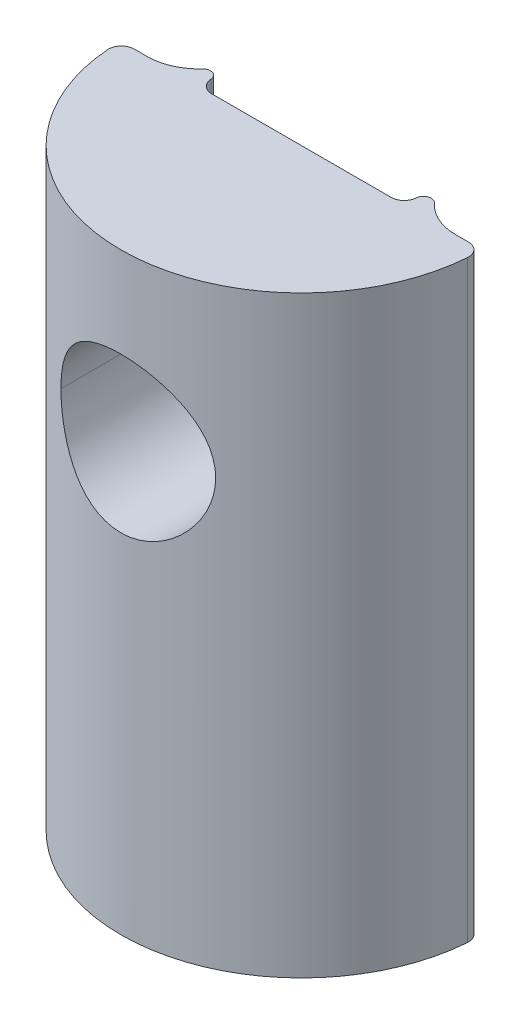
ISO-10303-21;
HEADER;
FILE_DESCRIPTION(('STEP AP214'),'2;1');
FILE_NAME('part.step','',(''),(''),'','','');
FILE_SCHEMA(('AUTOMOTIVE_DESIGN { 1 0 10303 214 1 1 1 1 }'));
ENDSEC;
DATA;
#1=APPLICATION_CONTEXT('core data for automotive mechanical design processes');
#2=APPLICATION_PROTOCOL_DEFINITION('international standard','automotive_design',2000,#1);
#3=PRODUCT_CONTEXT('',#1,'mechanical');
#4=PRODUCT('Part','Part','',(#3));
#5=PRODUCT_RELATED_PRODUCT_CATEGORY('part','',(#4));
#6=PRODUCT_DEFINITION_FORMATION('','',#4);
#7=PRODUCT_DEFINITION_CONTEXT('part definition',#1,'design');
#8=PRODUCT_DEFINITION('design','',#6,#7);
#9=PRODUCT_DEFINITION_SHAPE('','',#8);
#10=(LENGTH_UNIT() NAMED_UNIT(*) SI_UNIT(.MILLI.,.METRE.));
#11=(NAMED_UNIT(*) PLANE_ANGLE_UNIT() SI_UNIT($,.RADIAN.));
#12=(NAMED_UNIT(*) SI_UNIT($,.STERADIAN.) SOLID_ANGLE_UNIT());
#13=UNCERTAINTY_MEASURE_WITH_UNIT(LENGTH_MEASURE(1.E-05),#10,'distance_accuracy_value','');
#14=(GEOMETRIC_REPRESENTATION_CONTEXT(3) GLOBAL_UNCERTAINTY_ASSIGNED_CONTEXT((#13)) GLOBAL_UNIT_ASSIGNED_CONTEXT((#10,
#11,#12)) REPRESENTATION_CONTEXT('',''));
#15=CARTESIAN_POINT('',(0.,0.,0.));
#16=DIRECTION('',(0.,0.,1.));
#17=DIRECTION('',(1.,0.,0.));
#18=AXIS2_PLACEMENT_3D('',#15,#16,#17);
#19=CARTESIAN_POINT('',(0.,0.,3.5));
#20=DIRECTION('',(0.,0.,1.));
#21=DIRECTION('',(1.,0.,0.));
#22=AXIS2_PLACEMENT_3D('',#19,#20,#21);
#23=CYLINDRICAL_SURFACE('',#22,3.);
#24=DIRECTION('',(0.,0.,-1.));
#25=VECTOR('',#24,1.);
#26=CARTESIAN_POINT('',(3.,0.,3.5));
#27=LINE('',#26,#25);
#28=CARTESIAN_POINT('',(3.,0.,6.32455531171955));
#29=VERTEX_POINT('',#28);
#30=CARTESIAN_POINT('',(3.,0.,0.));
#31=VERTEX_POINT('',#30);
#32=EDGE_CURVE('E11',#29,#31,#27,.T.);
#33=ORIENTED_EDGE('',*,*,#32,.F.);
#34=CARTESIAN_POINT('',(0.,3.,6.9999999965));
#35=CARTESIAN_POINT('',(0.0489138956607457,3.00000410256812,7.00000183068981));
#36=CARTESIAN_POINT('',(0.0978278435569607,2.99881244268316,6.99948736787946));
#37=CARTESIAN_POINT('',(0.195458042792353,2.99404407710322,6.99744026648014));
#38=CARTESIAN_POINT('',(0.244174462670805,2.99047028760668,6.99590887282453));
#39=CARTESIAN_POINT('',(0.341388674207266,2.98093857612104,6.99183989532414));
#40=CARTESIAN_POINT('',(0.389886144636314,2.9749778785505,6.98930114011501));
#41=CARTESIAN_POINT('',(0.486642422012838,2.96067927481051,6.98323254092362));
#42=CARTESIAN_POINT('',(0.534899774330794,2.95233301995866,6.97969921694233));
#43=CARTESIAN_POINT('',(0.631955166421678,2.93311097183594,6.97158927104654));
#44=CARTESIAN_POINT('',(0.68074096910353,2.9221825258811,6.96699097871581));
#45=CARTESIAN_POINT('',(0.777631706234057,2.8979208908798,6.95684286423039));
#46=CARTESIAN_POINT('',(0.825736355299641,2.88458672428681,6.95129265531698));
#47=CARTESIAN_POINT('',(0.921249784753241,2.85551937419085,6.93928109739052));
#48=CARTESIAN_POINT('',(0.968656215972326,2.83977952123751,6.93281721921476));
#49=CARTESIAN_POINT('',(1.06276014613393,2.805906398884,6.91901830355708));
#50=CARTESIAN_POINT('',(1.10945266868913,2.78776109435895,6.91167890543437));
#51=CARTESIAN_POINT('',(1.20151674983731,2.74933384223792,6.89626881054077));
#52=CARTESIAN_POINT('',(1.24689417207534,2.72906422633106,6.88820236879365));
#53=CARTESIAN_POINT('',(1.33649365005603,2.68634183903295,6.87138000355238));
#54=CARTESIAN_POINT('',(1.38071539317606,2.66388848451788,6.86262389601609));
#55=CARTESIAN_POINT('',(1.46800061228671,2.61680356338657,6.84448436296802));
#56=CARTESIAN_POINT('',(1.51106086000438,2.59216660751874,6.83509940014924));
#57=CARTESIAN_POINT('',(1.59602303199206,2.54071933284691,6.81576245592253));
#58=CARTESIAN_POINT('',(1.63791842877036,2.51389917983221,6.80580797651569));
#59=CARTESIAN_POINT('',(1.71897218605899,2.45915698232891,6.78578085130398));
#60=CARTESIAN_POINT('',(1.75817518389837,2.43129602249619,6.77572174175876));
#61=CARTESIAN_POINT('',(1.83507382531065,2.3738123771556,6.75530043774594));
#62=CARTESIAN_POINT('',(1.87277199768456,2.34419287491043,6.74493880719775));
#63=CARTESIAN_POINT('',(1.94667121523819,2.28319625142322,6.72398294603298));
#64=CARTESIAN_POINT('',(1.98287179863101,2.25181859496752,6.71338864519074));
#65=CARTESIAN_POINT('',(2.05378816796158,2.18730950987627,6.69203473363754));
#66=CARTESIAN_POINT('',(2.08850023045642,2.15417409994325,6.68127479057027));
#67=CARTESIAN_POINT('',(2.15643473900844,2.0861710539031,6.65965946287236));
#68=CARTESIAN_POINT('',(2.18965093152526,2.05129723651427,6.64880387025238));
#69=CARTESIAN_POINT('',(2.25421462081131,1.98015080362108,6.62719170835579));
#70=CARTESIAN_POINT('',(2.28557031556905,1.94388569862687,6.61643491385857));
#71=CARTESIAN_POINT('',(2.34643460584564,1.86996037829845,6.5950952788966));
#72=CARTESIAN_POINT('',(2.37594796214921,1.83230419622083,6.58451204702107));
#73=CARTESIAN_POINT('',(2.4331501562864,1.7556006808286,6.56358952312516));
#74=CARTESIAN_POINT('',(2.46084002088053,1.71655414980125,6.55325009596707));
#75=CARTESIAN_POINT('',(2.51544514176985,1.63554813054925,6.53248973251664));
#76=CARTESIAN_POINT('',(2.54228531146726,1.59353458444912,6.52208202870025));
#77=CARTESIAN_POINT('',(2.59368570589883,1.50845697015938,6.50181145006659));
#78=CARTESIAN_POINT('',(2.61826159037612,1.46540320683219,6.49194505999556));
#79=CARTESIAN_POINT('',(2.66516388130064,1.37824915737547,6.47283086919287));
#80=CARTESIAN_POINT('',(2.68750119978789,1.33415538709659,6.46358014983501));
#81=CARTESIAN_POINT('',(2.72995675775495,1.24492577638461,6.44576332177738));
#82=CARTESIAN_POINT('',(2.75008074193835,1.19979301985005,6.43719545746664));
#83=CARTESIAN_POINT('',(2.78837481310104,1.10791371453158,6.42070132648431));
#84=CARTESIAN_POINT('',(2.80651755798841,1.06115409040791,6.41278433980888));
#85=CARTESIAN_POINT('',(2.84033763627126,0.96702433691713,6.39787629926695));
#86=CARTESIAN_POINT('',(2.85603300534015,0.919661758738418,6.39087853815674));
#87=CARTESIAN_POINT('',(2.88498694345635,0.824330166431908,6.37786022208387));
#88=CARTESIAN_POINT('',(2.89825740301884,0.776365415504366,6.37183491668052));
#89=CARTESIAN_POINT('',(2.92238885055373,0.679833090328599,6.36080333162924));
#90=CARTESIAN_POINT('',(2.93325516125109,0.631267104322355,6.35579480293342));
#91=CARTESIAN_POINT('',(2.95241539952209,0.534444262616765,6.34691678379841));
#92=CARTESIAN_POINT('',(2.96075218270494,0.486197626445365,6.34302838117267));
#93=CARTESIAN_POINT('',(2.97502443926764,0.389494585319185,6.33634681890388));
#94=CARTESIAN_POINT('',(2.98097042517302,0.341040066984096,6.33354886617335));
#95=CARTESIAN_POINT('',(2.99047711422751,0.243923933925383,6.32906594452896));
#96=CARTESIAN_POINT('',(2.99404157584831,0.195262768071483,6.32737922195395));
#97=CARTESIAN_POINT('',(2.99880249376857,0.0977345356951967,6.32512327778318));
#98=CARTESIAN_POINT('',(2.99999582224139,0.0488672823064986,6.32455553226866));
#99=CARTESIAN_POINT('',(3.00000000000001,0.,6.32455531171954));
#100=B_SPLINE_CURVE_WITH_KNOTS('',3,(#34,#35,#36,#37,#38,#39,#40,#41,#42,#43,#44,#45,#46,#47,
#48,#49,#50,#51,#52,#53,#54,#55,#56,#57,#58,#59,#60,#61,#62,#63,#64,#65,#66,#67,#68,#69,#70,#71,
#72,#73,#74,#75,#76,#77,#78,#79,#80,#81,#82,#83,#84,#85,#86,#87,#88,#89,#90,#91,#92,#93,#94,#95,
#96,#97,#98,#99),.UNSPECIFIED.,.F.,.F.,(4,2,2,2,2,2,2,2,2,2,2,2,2,2,2,2,2,2,2,2,2,2,2,2,2,2,2,2,
2,2,2,2,4),(0.,0.146724353003398,0.293269415423172,0.439985382799481,0.587221231205359,
0.737767381875317,0.888374844188878,1.0394076846051,1.19122690951126,1.34220909769009,
1.49323171392776,1.64463803391459,1.79676873642973,1.94412026021005,2.09121273661372,
2.23835023648207,2.38583655330257,2.53389102800831,2.6812354573499,2.82818186353915,
2.97504480780068,3.12777236482923,3.27934877431178,3.43014615635024,3.58054241711097,
3.7328047871791,3.88388583881275,4.03420492936246,4.18418781081787,4.33146595260845,
4.47808922650448,4.62448055257133,4.77106485957994),.UNSPECIFIED.);
#101=CARTESIAN_POINT('',(0.,3.,7.));
#102=VERTEX_POINT('',#101);
#103=EDGE_CURVE('E45',#102,#29,#100,.T.);
#104=ORIENTED_EDGE('',*,*,#103,.F.);
#105=CARTESIAN_POINT('',(-3.00000000000001,0.,6.32455532120638));
#106=CARTESIAN_POINT('',(-2.99999578067987,0.0488610884941441,6.32455556201012));
#107=CARTESIAN_POINT('',(-2.99880237394905,0.0977221237949391,6.3251233440901));
#108=CARTESIAN_POINT('',(-2.99404150046391,0.195242075926184,6.32737926709102));
#109=CARTESIAN_POINT('',(-2.99047696011818,0.243901167595723,6.32906602698356));
#110=CARTESIAN_POINT('',(-2.98097018764038,0.341017267780898,6.33354898726171));
#111=CARTESIAN_POINT('',(-2.97502399758109,0.389473803555633,6.33634703436644));
#112=CARTESIAN_POINT('',(-2.96075204472432,0.486185162747082,6.34302845581051));
#113=CARTESIAN_POINT('',(-2.95241558042182,0.534438065878152,6.34691670934559));
#114=CARTESIAN_POINT('',(-2.93325859568215,0.631255126632781,6.35579322073199));
#115=CARTESIAN_POINT('',(-2.92239609893613,0.679809276181625,6.36080000317929));
#116=CARTESIAN_POINT('',(-2.89826980495868,0.77632584393962,6.37182928037766));
#117=CARTESIAN_POINT('',(-2.88500028654843,0.824286555075943,6.3778541927061));
#118=CARTESIAN_POINT('',(-2.85604620863215,0.919618084370698,6.3908726498402));
#119=CARTESIAN_POINT('',(-2.84034936715286,0.966984498679958,6.39787110147149));
#120=CARTESIAN_POINT('',(-2.8065248349994,1.06113026779476,6.41278117670704));
#121=CARTESIAN_POINT('',(-2.78837873745477,1.10790191645522,6.42069964480129));
#122=CARTESIAN_POINT('',(-2.75008631876989,1.19978199128164,6.4371930640012));
#123=CARTESIAN_POINT('',(-2.72996844162914,1.24490401855048,6.44575836074386));
#124=CARTESIAN_POINT('',(-2.68752106913985,1.33411933304342,6.46357188618245));
#125=CARTESIAN_POINT('',(-2.66518546662969,1.3782093417975,6.47282198182139));
#126=CARTESIAN_POINT('',(-2.61828308202985,1.4653632906649,6.49193640882817));
#127=CARTESIAN_POINT('',(-2.59370503552738,1.50842050421211,6.50180375303508));
#128=CARTESIAN_POINT('',(-2.54229714594498,1.59351282540656,6.52207745198298));
#129=CARTESIAN_POINT('',(-2.51545131024215,1.63553740987359,6.5324873949923));
#130=CARTESIAN_POINT('',(-2.46084737008807,1.7165447561379,6.55324730940441));
#131=CARTESIAN_POINT('',(-2.43316530474621,1.75558225822029,6.56358387914665));
#132=CARTESIAN_POINT('',(-2.37597357145943,1.83227373900677,6.58450279784929));
#133=CARTESIAN_POINT('',(-2.34646257579085,1.86992668022379,6.59508532179467));
#134=CARTESIAN_POINT('',(-2.28559825175241,1.94385187983909,6.61642528401995));
#135=CARTESIAN_POINT('',(-2.25423986972264,1.98011985670866,6.62718313776741));
#136=CARTESIAN_POINT('',(-2.18966629905187,2.05127881501312,6.64879885872121));
#137=CARTESIAN_POINT('',(-2.15644263463874,2.08616203214861,6.65965695716492));
#138=CARTESIAN_POINT('',(-2.08850918772014,2.15416624695764,6.68127194677008));
#139=CARTESIAN_POINT('',(-2.05380646599875,2.18729422347691,6.69202907259372));
#140=CARTESIAN_POINT('',(-1.9829026314211,2.25179340415144,6.71337952379864));
#141=CARTESIAN_POINT('',(-1.94670498310273,2.28316831297989,6.72397315748461));
#142=CARTESIAN_POINT('',(-1.87280577184828,2.34416479323062,6.7449294537023));
#143=CARTESIAN_POINT('',(-1.83510441952983,2.37378660876788,6.75529214826598));
#144=CARTESIAN_POINT('',(-1.75819374011222,2.43128073424602,6.77571698959127));
#145=CARTESIAN_POINT('',(-1.71898164729149,2.4591495630969,6.78577851875423));
#146=CARTESIAN_POINT('',(-1.63792908550069,2.51389304462381,6.80580534810507));
#147=CARTESIAN_POINT('',(-1.59604467120375,2.54070756296147,6.81575732376021));
#148=CARTESIAN_POINT('',(-1.51109722326357,2.59214733004908,6.83509133919237));
#149=CARTESIAN_POINT('',(-1.46804049442281,2.6167820781674,6.84447578913597));
#150=CARTESIAN_POINT('',(-1.38075530277858,2.66386682775441,6.86261589492934));
#151=CARTESIAN_POINT('',(-1.33652985665317,2.68632186542965,6.87137298738504));
#152=CARTESIAN_POINT('',(-1.24691606838297,2.72905245166779,6.88819848340603));
#153=CARTESIAN_POINT('',(-1.20152784508374,2.74932822187819,6.89626695699169));
#154=CARTESIAN_POINT('',(-1.10946440255224,2.78775719091274,6.91167694443965));
#155=CARTESIAN_POINT('',(-1.06278384531099,2.80589916435971,6.91901458510286));
#156=CARTESIAN_POINT('',(-0.9686959225039,2.83976783736886,6.93281164460099));
#157=CARTESIAN_POINT('',(-0.92129337792677,2.85550619702677,6.93927528453403));
#158=CARTESIAN_POINT('',(-0.825779977304377,2.88457337347383,6.95128750399208));
#159=CARTESIAN_POINT('',(-0.777671332072392,2.89790846721915,6.95683846386559));
#160=CARTESIAN_POINT('',(-0.680764845660936,2.92217525344921,6.96698873191656));
#161=CARTESIAN_POINT('',(-0.631967173706777,2.93310752550592,6.97158826956577));
#162=CARTESIAN_POINT('',(-0.534905956264028,2.95233283999161,6.97969870187886));
#163=CARTESIAN_POINT('',(-0.486654854935068,2.96067941657798,6.98323163354532));
#164=CARTESIAN_POINT('',(-0.389906895408441,2.97497832760148,6.98929996823023));
#165=CARTESIAN_POINT('',(-0.341411458523094,2.98093881936556,6.9918387692294));
#166=CARTESIAN_POINT('',(-0.244197234236593,2.99047044617199,6.99590809340556));
#167=CARTESIAN_POINT('',(-0.195478744837515,2.99404415634933,6.99743970322891));
#168=CARTESIAN_POINT('',(-0.0978402664500884,2.99881256538368,6.99948723790311));
#169=CARTESIAN_POINT('',(-0.0489200972326889,3.0000041457895,7.00000183136565));
#170=CARTESIAN_POINT('',(0.,3.,6.9999999965));
#171=B_SPLINE_CURVE_WITH_KNOTS('',3,(#105,#106,#107,#108,#109,#110,#111,#112,#113,#114,#115,
#116,#117,#118,#119,#120,#121,#122,#123,#124,#125,#126,#127,#128,#129,#130,#131,#132,#133,#134,
#135,#136,#137,#138,#139,#140,#141,#142,#143,#144,#145,#146,#147,#148,#149,#150,#151,#152,#153,
#154,#155,#156,#157,#158,#159,#160,#161,#162,#163,#164,#165,#166,#167,#168,#169,#170),
.UNSPECIFIED.,.F.,.F.,(4,2,2,2,2,2,2,2,2,2,2,2,2,2,2,2,2,2,2,2,2,2,2,2,2,2,2,2,2,2,2,2,4),(0.,
0.14656569326264,0.292950832681692,0.439580257271737,0.586876691264983,0.736822054295223,
0.88712860277196,1.03822219669676,1.19052209096397,1.34088070119776,1.49166550038102,
1.64325449364661,1.79601971314571,1.94284600785377,2.08978016979066,2.23713684476672,
2.3852279834108,2.53267763817614,2.679802893322,2.82690761311282,2.97429578768847,
3.12638886192696,3.27778261152628,3.42881779748031,3.57983760748155,3.73161937375716,
3.88263969812263,4.03325967643252,4.18384328452363,4.33106076841585,4.47777057019049,
4.62432182771311,4.7710648104984),.UNSPECIFIED.);
#172=CARTESIAN_POINT('',(-3.,0.,6.32455532120638));
#173=VERTEX_POINT('',#172);
#174=EDGE_CURVE('E308',#173,#102,#171,.T.);
#175=ORIENTED_EDGE('',*,*,#174,.F.);
#176=DIRECTION('',(0.,0.,1.));
#177=VECTOR('',#176,1.);
#178=CARTESIAN_POINT('',(-3.,0.,3.5));
#179=LINE('',#178,#177);
#180=CARTESIAN_POINT('',(-3.,0.,0.));
#181=VERTEX_POINT('',#180);
#182=EDGE_CURVE('E31',#181,#173,#179,.T.);
#183=ORIENTED_EDGE('',*,*,#182,.F.);
#184=CARTESIAN_POINT('',(0.,0.,0.));
#185=DIRECTION('',(0.,0.,1.));
#186=DIRECTION('',(1.,0.,0.));
#187=AXIS2_PLACEMENT_3D('',#184,#185,#186);
#188=CIRCLE('',#187,3.);
#189=EDGE_CURVE('E360',#31,#181,#188,.T.);
#190=ORIENTED_EDGE('',*,*,#189,.F.);
#191=EDGE_LOOP('',(#33,#104,#175,#183,#190));
#192=FACE_BOUND('',#191,.T.);
#193=ADVANCED_FACE('F17',(#192),#23,.F.);
#194=CARTESIAN_POINT('',(0.,0.,3.5));
#195=DIRECTION('',(0.,0.,1.));
#196=DIRECTION('',(1.,0.,0.));
#197=AXIS2_PLACEMENT_3D('',#194,#195,#196);
#198=CYLINDRICAL_SURFACE('',#197,3.);
#199=ORIENTED_EDGE('',*,*,#32,.T.);
#200=CARTESIAN_POINT('',(0.,0.,0.));
#201=DIRECTION('',(0.,0.,1.));
#202=DIRECTION('',(1.,0.,0.));
#203=AXIS2_PLACEMENT_3D('',#200,#201,#202);
#204=CIRCLE('',#203,3.);
#205=EDGE_CURVE('E332',#181,#31,#204,.T.);
#206=ORIENTED_EDGE('',*,*,#205,.F.);
#207=ORIENTED_EDGE('',*,*,#182,.T.);
#208=CARTESIAN_POINT('',(0.,-3.,6.9999999965));
#209=CARTESIAN_POINT('',(-0.0489138956500198,-3.00000410256812,7.00000183082956));
#210=CARTESIAN_POINT('',(-0.0978278435369969,-2.99881244268363,6.99948736815919));
#211=CARTESIAN_POINT('',(-0.195458042754489,-2.99404407710535,6.99744026703976));
#212=CARTESIAN_POINT('',(-0.244174462624281,-2.99047028761012,6.99590887352411));
#213=CARTESIAN_POINT('',(-0.341388674143992,-2.98093857612779,6.99183989630365));
#214=CARTESIAN_POINT('',(-0.389886144564967,-2.97497787855939,6.98930114123455));
#215=CARTESIAN_POINT('',(-0.486642421925887,-2.96067927482438,6.9832325423233));
#216=CARTESIAN_POINT('',(-0.534899774236343,-2.9523330199755,6.97969921848217));
#217=CARTESIAN_POINT('',(-0.631955166322517,-2.9331109718575,6.9715892728684));
#218=CARTESIAN_POINT('',(-0.680740969007139,-2.92218252590403,6.96699098067934));
#219=CARTESIAN_POINT('',(-0.777631706142331,-2.89792089090529,6.95684286647614));
#220=CARTESIAN_POINT('',(-0.82573635520986,-2.88458672431362,6.95129265770332));
#221=CARTESIAN_POINT('',(-0.921249784666409,-2.85551937422017,6.9392811000571));
#222=CARTESIAN_POINT('',(-0.968656215886559,-2.83977952126814,6.93281722202103));
#223=CARTESIAN_POINT('',(-1.06276014604925,-2.80590639891703,6.91901830664194));
#224=CARTESIAN_POINT('',(-1.10945266860453,-2.78776109439318,6.91167890865818));
#225=CARTESIAN_POINT('',(-1.20151674975731,-2.74933384227241,6.89626881403912));
#226=CARTESIAN_POINT('',(-1.24689417199978,-2.72906422636445,6.88820237242757));
#227=CARTESIAN_POINT('',(-1.33649364999069,-2.68634183906335,6.87138000745499));
#228=CARTESIAN_POINT('',(-1.38071539311649,-2.66388848454635,6.86262390005181));
#229=CARTESIAN_POINT('',(-1.46800061223978,-2.61680356341022,6.84448436726754));
#230=CARTESIAN_POINT('',(-1.51106085996431,-2.59216660753947,6.83509940457944));
#231=CARTESIAN_POINT('',(-1.59602303196684,-2.5407193328611,6.81576246061163));
#232=CARTESIAN_POINT('',(-1.63791842875311,-2.51389917984276,6.805807981333));
#233=CARTESIAN_POINT('',(-1.71897218605162,-2.45915698233492,6.78578085637207));
#234=CARTESIAN_POINT('',(-1.7581751838931,-2.43129602250161,6.77572174694959));
#235=CARTESIAN_POINT('',(-1.83507382531206,-2.3738123771567,6.7553004431784));
#236=CARTESIAN_POINT('',(-1.87277199769043,-2.34419287490767,6.74493881274908));
#237=CARTESIAN_POINT('',(-1.94667121525542,-2.28319625140984,6.72398295181808));
#238=CARTESIAN_POINT('',(-1.98287179865499,-2.25181859494724,6.71338865109073));
#239=CARTESIAN_POINT('',(-2.05378816800131,-2.18730950983931,6.69203473976323));
#240=CARTESIAN_POINT('',(-2.088500230505,-2.15417409989635,6.68127479680675));
#241=CARTESIAN_POINT('',(-2.15643473906942,-2.0861710538403,6.65965946932857));
#242=CARTESIAN_POINT('',(-2.18965093158999,-2.0512972364457,6.64880387681751));
#243=CARTESIAN_POINT('',(-2.25421462088364,-1.9801508035397,6.62719171513396));
#244=CARTESIAN_POINT('',(-2.28557031564517,-1.94388569853838,6.6164349207409));
#245=CARTESIAN_POINT('',(-2.34643460592935,-1.86996037819459,6.59509528598236));
#246=CARTESIAN_POINT('',(-2.37594796223664,-1.83230419610864,6.58451205420616));
#247=CARTESIAN_POINT('',(-2.43315015638094,-1.7556006806985,6.56358953050407));
#248=CARTESIAN_POINT('',(-2.46084002097838,-1.7165541496615,6.55325010344048));
#249=CARTESIAN_POINT('',(-2.51544514186967,-1.63554813039564,6.53248974017938));
#250=CARTESIAN_POINT('',(-2.54228531156591,-1.59353458429151,6.52208203645757));
#251=CARTESIAN_POINT('',(-2.59368570599485,-1.50845696999456,6.50181145800649));
#252=CARTESIAN_POINT('',(-2.61826159047064,-1.46540320666411,6.49194506802349));
#253=CARTESIAN_POINT('',(-2.66516388139155,-1.37824915720163,6.47283087739023));
#254=CARTESIAN_POINT('',(-2.68750119987666,-1.33415538692019,6.46358015811381));
#255=CARTESIAN_POINT('',(-2.72995675783838,-1.24492577620374,6.44576333021248));
#256=CARTESIAN_POINT('',(-2.75008074201853,-1.19979301966723,6.43719546597663));
#257=CARTESIAN_POINT('',(-2.78837481317346,-1.10791371434805,6.42070133513833));
#258=CARTESIAN_POINT('',(-2.80651755805635,-1.06115409022569,6.41278434853194));
#259=CARTESIAN_POINT('',(-2.84033763633076,-0.967024336739424,6.39787630811945));
#260=CARTESIAN_POINT('',(-2.85603300539563,-0.91966175856388,6.39087854706972));
#261=CARTESIAN_POINT('',(-2.88498694350386,-0.824330166265483,6.37786023110919));
#262=CARTESIAN_POINT('',(-2.89825740306237,-0.776365415342863,6.37183492575776));
#263=CARTESIAN_POINT('',(-2.922388850589,-0.679833090178674,6.36080334080173));
#264=CARTESIAN_POINT('',(-2.93325516128206,-0.631267104179079,6.35579481214927));
#265=CARTESIAN_POINT('',(-2.95241539954452,-0.534444262490286,6.34691679309141));
#266=CARTESIAN_POINT('',(-2.9607521827232,-0.486197626329022,6.34302839049959));
#267=CARTESIAN_POINT('',(-2.97502443927901,-0.389494585223984,6.33634682828887));
#268=CARTESIAN_POINT('',(-2.98097042518165,-0.341040066899888,6.33354887558255));
#269=CARTESIAN_POINT('',(-2.99047711423178,-0.243923933863967,6.32906595397692));
#270=CARTESIAN_POINT('',(-2.99404157585096,-0.195262768021864,6.32737923141646));
#271=CARTESIAN_POINT('',(-2.99880249376905,-0.09773453566998,6.32512328726514));
#272=CARTESIAN_POINT('',(-2.99999582224135,-0.048867282293889,6.3245555417555));
#273=CARTESIAN_POINT('',(-3.00000000000001,0.,6.32455532120638));
#274=B_SPLINE_CURVE_WITH_KNOTS('',3,(#208,#209,#210,#211,#212,#213,#214,#215,#216,#217,#218,
#219,#220,#221,#222,#223,#224,#225,#226,#227,#228,#229,#230,#231,#232,#233,#234,#235,#236,#237,
#238,#239,#240,#241,#242,#243,#244,#245,#246,#247,#248,#249,#250,#251,#252,#253,#254,#255,#256,
#257,#258,#259,#260,#261,#262,#263,#264,#265,#266,#267,#268,#269,#270,#271,#272,#273),
.UNSPECIFIED.,.F.,.F.,(4,2,2,2,2,2,2,2,2,2,2,2,2,2,2,2,2,2,2,2,2,2,2,2,2,2,2,2,2,2,2,2,4),(0.,
0.146724352971256,0.29326941535172,0.439985382681464,0.587221231033469,0.737767381671623,
0.888374843943044,1.03940768430719,1.19122690915178,1.34220909727872,1.49323171346466,
1.64463803340039,1.79676873586551,1.94412025957642,2.09121273592195,2.23835023574401,
2.38583655253054,2.53389102718419,2.68123545648031,2.8281818626311,2.97504480686141,
3.12777236384007,3.27934877327723,3.43014615527463,3.5805424159984,3.73280478602599,
3.88388583762193,4.03420492813578,4.18418780955619,4.33146595130696,4.47808922516542,
4.6244805511954,4.77106485816624),.UNSPECIFIED.);
#275=CARTESIAN_POINT('',(0.,-3.,7.));
#276=VERTEX_POINT('',#275);
#277=EDGE_CURVE('E214',#276,#173,#274,.T.);
#278=ORIENTED_EDGE('',*,*,#277,.F.);
#279=CARTESIAN_POINT('',(3.00000000000001,0.,6.32455531171954));
#280=CARTESIAN_POINT('',(2.99999578067985,-0.0488610885083919,6.3245555525233));
#281=CARTESIAN_POINT('',(2.99880237394847,-0.0977221238234378,6.32512333460819));
#282=CARTESIAN_POINT('',(2.99404150046109,-0.195242075981274,6.32737925762859));
#283=CARTESIAN_POINT('',(2.99047696011374,-0.243901167663158,6.32906601753569));
#284=CARTESIAN_POINT('',(2.9809701876316,-0.341017267871124,6.33354897785258));
#285=CARTESIAN_POINT('',(2.97502399756963,-0.389473803656308,6.3363470249815));
#286=CARTESIAN_POINT('',(2.96075204470598,-0.48618516286669,6.34302844648363));
#287=CARTESIAN_POINT('',(2.95241558039932,-0.53443806600624,6.34691670005263));
#288=CARTESIAN_POINT('',(2.93325859565066,-0.631255126777346,6.35579321151637));
#289=CARTESIAN_POINT('',(2.92239609889975,-0.679809276334138,6.36079999400729));
#290=CARTESIAN_POINT('',(2.89826980491327,-0.77632584410545,6.37182927130122));
#291=CARTESIAN_POINT('',(2.8850002864989,-0.824286555247145,6.37785418368164));
#292=CARTESIAN_POINT('',(2.85604620857466,-0.91961808455001,6.39087264092807));
#293=CARTESIAN_POINT('',(2.84034936709154,-0.966984498862002,6.39787109261976));
#294=CARTESIAN_POINT('',(2.80652483493036,-1.06113026797957,6.41278116798443));
#295=CARTESIAN_POINT('',(2.78837873738186,-1.10790191664005,6.42069963614746));
#296=CARTESIAN_POINT('',(2.75008631869136,-1.19978199146032,6.43719305549048));
#297=CARTESIAN_POINT('',(2.72996844154903,-1.2449040187231,6.4457583523073));
#298=CARTESIAN_POINT('',(2.68752106905674,-1.33411933320614,6.46357187790122));
#299=CARTESIAN_POINT('',(2.66518546654497,-1.37820934195629,6.4728219736214));
#300=CARTESIAN_POINT('',(2.61828308194151,-1.46536329081789,6.49193640079767));
#301=CARTESIAN_POINT('',(2.59370503543686,-1.50842050436312,6.50180374509291));
#302=CARTESIAN_POINT('',(2.54229714584973,-1.59351282555593,6.5220774442243));
#303=CARTESIAN_POINT('',(2.51545131014418,-1.63553741002317,6.53248738732884));
#304=CARTESIAN_POINT('',(2.46084736999462,-1.71654475627252,6.5532473019293));
#305=CARTESIAN_POINT('',(2.43316530466061,-1.75558225834027,6.56358387176436));
#306=CARTESIAN_POINT('',(2.37597357138703,-1.83227373910218,6.58450279065868));
#307=CARTESIAN_POINT('',(2.34646257572355,-1.86992668030907,6.59508531470295));
#308=CARTESIAN_POINT('',(2.2855982516927,-1.94385187990897,6.61642527713187));
#309=CARTESIAN_POINT('',(2.25423986966519,-1.98011985677305,6.6271831309841));
#310=CARTESIAN_POINT('',(2.18966629899615,-2.05127881507152,6.64879885215309));
#311=CARTESIAN_POINT('',(2.15644263458227,-2.0861620322063,6.65965695070725));
#312=CARTESIAN_POINT('',(2.08850918766809,-2.15416624700867,6.68127194053467));
#313=CARTESIAN_POINT('',(2.05380646595213,-2.18729422352224,6.69202906647011));
#314=CARTESIAN_POINT('',(1.98290263138551,-2.25179340418558,6.71337951790199));
#315=CARTESIAN_POINT('',(1.94670498307271,-2.28316831300852,6.7239731517031));
#316=CARTESIAN_POINT('',(1.87280577182958,-2.34416479324868,6.74492944815442));
#317=CARTESIAN_POINT('',(1.83510441951687,-2.37378660878085,6.75529214283657));
#318=CARTESIAN_POINT('',(1.75819374011053,-2.43128073424901,6.77571698440217));
#319=CARTESIAN_POINT('',(1.71898164729533,-2.45914956309498,6.78577851368697));
#320=CARTESIAN_POINT('',(1.63792908551365,-2.51389304461436,6.80580534328879));
#321=CARTESIAN_POINT('',(1.59604467122023,-2.54070756294932,6.81575731907312));
#322=CARTESIAN_POINT('',(1.51109722328898,-2.59214733003175,6.83509133476531));
#323=CARTESIAN_POINT('',(1.46804049445371,-2.61678207814767,6.84447578483978));
#324=CARTESIAN_POINT('',(1.38075530282213,-2.66386682772991,6.86261589089671));
#325=CARTESIAN_POINT('',(1.33652985670395,-2.68632186540288,6.87137298348515));
#326=CARTESIAN_POINT('',(1.24691606844975,-2.72905245163645,6.8881984797736));
#327=CARTESIAN_POINT('',(1.20152784515936,-2.74932822184468,6.89626695349404));
#328=CARTESIAN_POINT('',(1.10946440263589,-2.7877571908798,6.91167694121598));
#329=CARTESIAN_POINT('',(1.06278384539363,-2.80589916432913,6.91901458201825));
#330=CARTESIAN_POINT('',(0.968695922586127,-2.83976783734216,6.9328116417951));
#331=CARTESIAN_POINT('',(0.921293378009685,-2.85550619700177,6.93927528186785));
#332=CARTESIAN_POINT('',(0.825779977390214,-2.88457337345138,6.95128750160607));
#333=CARTESIAN_POINT('',(0.77767133216054,-2.89790846719774,6.95683846162013));
#334=CARTESIAN_POINT('',(0.68076484575515,-2.92217525342873,6.96698872995316));
#335=CARTESIAN_POINT('',(0.631967173804808,-2.93310752548553,6.97158826774397));
#336=CARTESIAN_POINT('',(0.534905956353969,-2.95233283997479,6.97969870033937));
#337=CARTESIAN_POINT('',(0.486654855013016,-2.96067941656398,6.98323163214626));
#338=CARTESIAN_POINT('',(0.389906895464797,-2.97497832759231,6.98929996711148));
#339=CARTESIAN_POINT('',(0.341411458569904,-2.98093881935864,6.99183876825063));
#340=CARTESIAN_POINT('',(0.244197234266663,-2.99047044616843,6.99590809270648));
#341=CARTESIAN_POINT('',(0.195478744860424,-2.99404415634714,6.99743970266963));
#342=CARTESIAN_POINT('',(0.0978402664610813,-2.99881256538313,6.99948723762343));
#343=CARTESIAN_POINT('',(0.0489200972389384,-3.00000414578949,7.00000183122587));
#344=CARTESIAN_POINT('',(0.,-3.,6.9999999965));
#345=B_SPLINE_CURVE_WITH_KNOTS('',3,(#279,#280,#281,#282,#283,#284,#285,#286,#287,#288,#289,
#290,#291,#292,#293,#294,#295,#296,#297,#298,#299,#300,#301,#302,#303,#304,#305,#306,#307,#308,
#309,#310,#311,#312,#313,#314,#315,#316,#317,#318,#319,#320,#321,#322,#323,#324,#325,#326,#327,
#328,#329,#330,#331,#332,#333,#334,#335,#336,#337,#338,#339,#340,#341,#342,#343,#344),
.UNSPECIFIED.,.F.,.F.,(4,2,2,2,2,2,2,2,2,2,2,2,2,2,2,2,2,2,2,2,2,2,2,2,2,2,2,2,2,2,2,2,4),(0.,
0.146565693305324,0.292950832762898,0.439580257388858,0.586876691417018,0.736822054486525,
0.887128603000546,1.03822219696162,1.19052209126504,1.34088070152234,1.49166550074219,
1.64325449405763,1.79601971361991,1.94284600833843,2.08978017030686,2.23713684533531,
2.38522798405233,2.53267763886808,2.67980289406568,2.82690761390919,2.97429578853815,
3.1263888628398,3.27778261249466,3.42881779849594,3.57983760853551,3.73161937487698,
3.88263969929595,4.03325967764665,4.18384328576562,4.33106076972497,4.47777057155063,
4.62432182910807,4.77106481191205),.UNSPECIFIED.);
#346=EDGE_CURVE('E292',#29,#276,#345,.T.);
#347=ORIENTED_EDGE('',*,*,#346,.F.);
#348=EDGE_LOOP('',(#199,#206,#207,#278,#347));
#349=FACE_BOUND('',#348,.T.);
#350=ADVANCED_FACE('F231',(#349),#198,.F.);
#351=CARTESIAN_POINT('',(3.48229947,-16.5,-0.5));
#352=DIRECTION('',(0.,1.,0.));
#353=DIRECTION('',(0.,0.,1.));
#354=AXIS2_PLACEMENT_3D('',#351,#352,#353);
#355=CYLINDRICAL_SURFACE('',#354,0.499999998);
#356=CARTESIAN_POINT('',(3.48229947,6.5,-0.5));
#357=DIRECTION('',(0.,1.,0.));
#358=DIRECTION('',(0.,0.,1.));
#359=AXIS2_PLACEMENT_3D('',#356,#357,#358);
#360=CIRCLE('',#359,0.499999998);
#361=CARTESIAN_POINT('',(3.48229948,6.5,0.));
#362=VERTEX_POINT('',#361);
#363=CARTESIAN_POINT('',(3.98132195411523,6.5,-0.468749999742162));
#364=VERTEX_POINT('',#363);
#365=EDGE_CURVE('E172',#362,#364,#360,.T.);
#366=ORIENTED_EDGE('',*,*,#365,.T.);
#367=DIRECTION('',(0.,1.,0.));
#368=VECTOR('',#367,1.);
#369=CARTESIAN_POINT('',(3.98132195411523,-16.5,-0.468749999742162));
#370=LINE('',#369,#368);
#371=CARTESIAN_POINT('',(3.98132195411523,-16.5,-0.468749999742162));
#372=VERTEX_POINT('',#371);
#373=EDGE_CURVE('E158',#372,#364,#370,.T.);
#374=ORIENTED_EDGE('',*,*,#373,.F.);
#375=CARTESIAN_POINT('',(3.48229947,-16.5,-0.5));
#376=DIRECTION('',(0.,1.,0.));
#377=DIRECTION('',(0.,0.,1.));
#378=AXIS2_PLACEMENT_3D('',#375,#376,#377);
#379=CIRCLE('',#378,0.499999998);
#380=CARTESIAN_POINT('',(3.48229948,-16.5,0.));
#381=VERTEX_POINT('',#380);
#382=EDGE_CURVE('E329',#381,#372,#379,.T.);
#383=ORIENTED_EDGE('',*,*,#382,.F.);
#384=DIRECTION('',(0.,1.,0.));
#385=VECTOR('',#384,1.);
#386=CARTESIAN_POINT('',(3.48229948,-16.5,0.));
#387=LINE('',#386,#385);
#388=EDGE_CURVE('E175',#381,#362,#387,.T.);
#389=ORIENTED_EDGE('',*,*,#388,.T.);
#390=EDGE_LOOP('',(#366,#374,#383,#389));
#391=FACE_BOUND('',#390,.T.);
#392=ADVANCED_FACE('F173',(#391),#355,.F.);
#393=CARTESIAN_POINT('',(4.28073544,-16.5,-0.45));
#394=DIRECTION('',(0.,1.,0.));
#395=DIRECTION('',(0.738810674912382,0.,-0.673913040855799));
#396=AXIS2_PLACEMENT_3D('',#393,#394,#395);
#397=CYLINDRICAL_SURFACE('',#396,0.299999996700001);
#398=CARTESIAN_POINT('',(4.28073544,6.5,-0.45));
#399=DIRECTION('',(0.,-1.,0.));
#400=DIRECTION('',(0.738810674912382,0.,-0.673913040855799));
#401=AXIS2_PLACEMENT_3D('',#398,#399,#400);
#402=CIRCLE('',#401,0.299999996700001);
#403=CARTESIAN_POINT('',(4.50237864422136,6.5,-0.652173913852639));
#404=VERTEX_POINT('',#403);
#405=EDGE_CURVE('E162',#364,#404,#402,.T.);
#406=ORIENTED_EDGE('',*,*,#405,.T.);
#407=DIRECTION('',(0.,1.,0.));
#408=VECTOR('',#407,1.);
#409=CARTESIAN_POINT('',(4.50237864422136,-16.5,-0.652173913852639));
#410=LINE('',#409,#408);
#411=CARTESIAN_POINT('',(4.50237864422136,-16.5,-0.652173913852639));
#412=VERTEX_POINT('',#411);
#413=EDGE_CURVE('E204',#412,#404,#410,.T.);
#414=ORIENTED_EDGE('',*,*,#413,.F.);
#415=CARTESIAN_POINT('',(4.28073544,-16.5,-0.45));
#416=DIRECTION('',(0.,1.,0.));
#417=DIRECTION('',(0.738810674912382,0.,-0.673913040855799));
#418=AXIS2_PLACEMENT_3D('',#415,#416,#417);
#419=CIRCLE('',#418,0.299999996700001);
#420=EDGE_CURVE('E165',#412,#372,#419,.T.);
#421=ORIENTED_EDGE('',*,*,#420,.T.);
#422=ORIENTED_EDGE('',*,*,#373,.T.);
#423=EDGE_LOOP('',(#406,#414,#421,#422));
#424=FACE_BOUND('',#423,.T.);
#425=ADVANCED_FACE('F160',(#424),#397,.T.);
#426=CARTESIAN_POINT('',(5.97999999,-16.5,-2.));
#427=DIRECTION('',(0.,1.,0.));
#428=DIRECTION('',(-0.738810672889322,0.,0.67391304307368));
#429=AXIS2_PLACEMENT_3D('',#426,#427,#428);
#430=CYLINDRICAL_SURFACE('',#429,2.);
#431=CARTESIAN_POINT('',(5.97999999,6.5,-2.));
#432=DIRECTION('',(0.,1.,0.));
#433=DIRECTION('',(-0.738810672889322,0.,0.67391304307368));
#434=AXIS2_PLACEMENT_3D('',#431,#432,#433);
#435=CIRCLE('',#434,2.);
#436=CARTESIAN_POINT('',(5.97999999,6.5,0.));
#437=VERTEX_POINT('',#436);
#438=EDGE_CURVE('E168',#404,#437,#435,.T.);
#439=ORIENTED_EDGE('',*,*,#438,.T.);
#440=DIRECTION('',(0.,1.,0.));
#441=VECTOR('',#440,1.);
#442=CARTESIAN_POINT('',(5.97999999,-16.5,0.));
#443=LINE('',#442,#441);
#444=CARTESIAN_POINT('',(5.97999999,-16.5,0.));
#445=VERTEX_POINT('',#444);
#446=EDGE_CURVE('E337',#445,#437,#443,.T.);
#447=ORIENTED_EDGE('',*,*,#446,.F.);
#448=CARTESIAN_POINT('',(5.97999999,-16.5,-2.));
#449=DIRECTION('',(0.,1.,0.));
#450=DIRECTION('',(-0.738810672889322,0.,0.67391304307368));
#451=AXIS2_PLACEMENT_3D('',#448,#449,#450);
#452=CIRCLE('',#451,2.);
#453=EDGE_CURVE('E333',#412,#445,#452,.T.);
#454=ORIENTED_EDGE('',*,*,#453,.F.);
#455=ORIENTED_EDGE('',*,*,#413,.T.);
#456=EDGE_LOOP('',(#439,#447,#454,#455));
#457=FACE_BOUND('',#456,.T.);
#458=ADVANCED_FACE('F259',(#457),#430,.F.);
#459=CARTESIAN_POINT('',(6.23037034,-16.5,0.));
#460=DIRECTION('',(0.,0.,-1.));
#461=DIRECTION('',(0.,-1.,0.));
#462=AXIS2_PLACEMENT_3D('',#459,#460,#461);
#463=PLANE('',#462);
#464=DIRECTION('',(1.,0.,0.));
#465=VECTOR('',#464,1.);
#466=CARTESIAN_POINT('',(6.48074069,6.5,0.));
#467=LINE('',#466,#465);
#468=CARTESIAN_POINT('',(6.48074069,6.5,-4.79999956448651E-09));
#469=VERTEX_POINT('',#468);
#470=EDGE_CURVE('E324',#437,#469,#467,.T.);
#471=ORIENTED_EDGE('',*,*,#470,.T.);
#472=DIRECTION('',(0.,1.,0.));
#473=VECTOR('',#472,1.);
#474=CARTESIAN_POINT('',(6.48074069,-16.5,-4.79999956448651E-09));
#475=LINE('',#474,#473);
#476=CARTESIAN_POINT('',(6.48074069,-16.5,-4.79999956448651E-09));
#477=VERTEX_POINT('',#476);
#478=EDGE_CURVE('E351',#477,#469,#475,.T.);
#479=ORIENTED_EDGE('',*,*,#478,.F.);
#480=DIRECTION('',(-1.,0.,0.));
#481=VECTOR('',#480,1.);
#482=CARTESIAN_POINT('',(6.48074069,-16.5,0.));
#483=LINE('',#482,#481);
#484=EDGE_CURVE('E328',#477,#445,#483,.T.);
#485=ORIENTED_EDGE('',*,*,#484,.T.);
#486=ORIENTED_EDGE('',*,*,#446,.T.);
#487=EDGE_LOOP('',(#471,#479,#485,#486));
#488=FACE_BOUND('',#487,.T.);
#489=ADVANCED_FACE('F250',(#488),#463,.T.);
#490=CARTESIAN_POINT('',(6.48074069,-16.5,0.5));
#491=DIRECTION('',(0.,1.,0.));
#492=DIRECTION('',(0.997037030344343,0.,0.0769230792554071));
#493=AXIS2_PLACEMENT_3D('',#490,#491,#492);
#494=CYLINDRICAL_SURFACE('',#493,0.5000000048);
#495=CARTESIAN_POINT('',(6.48074069,6.5,0.5));
#496=DIRECTION('',(0.,-1.,0.));
#497=DIRECTION('',(0.997037030344343,0.,0.0769230792554071));
#498=AXIS2_PLACEMENT_3D('',#495,#496,#497);
#499=CIRCLE('',#498,0.5000000048);
#500=CARTESIAN_POINT('',(6.97925920010021,6.5,0.538461539231341));
#501=VERTEX_POINT('',#500);
#502=EDGE_CURVE('E334',#469,#501,#499,.T.);
#503=ORIENTED_EDGE('',*,*,#502,.T.);
#504=DIRECTION('',(0.,1.,0.));
#505=VECTOR('',#504,1.);
#506=CARTESIAN_POINT('',(6.97925920010021,-16.5,0.538461539231341));
#507=LINE('',#506,#505);
#508=CARTESIAN_POINT('',(6.97925920010021,-16.5,0.538461539231341));
#509=VERTEX_POINT('',#508);
#510=EDGE_CURVE('E389',#509,#501,#507,.T.);
#511=ORIENTED_EDGE('',*,*,#510,.F.);
#512=CARTESIAN_POINT('',(6.48074069,-16.5,0.5));
#513=DIRECTION('',(0.,1.,0.));
#514=DIRECTION('',(0.997037030344343,0.,0.0769230792554071));
#515=AXIS2_PLACEMENT_3D('',#512,#513,#514);
#516=CIRCLE('',#515,0.5000000048);
#517=EDGE_CURVE('E338',#509,#477,#516,.T.);
#518=ORIENTED_EDGE('',*,*,#517,.T.);
#519=ORIENTED_EDGE('',*,*,#478,.T.);
#520=EDGE_LOOP('',(#503,#511,#518,#519));
#521=FACE_BOUND('',#520,.T.);
#522=ADVANCED_FACE('F248',(#521),#494,.T.);
#523=CARTESIAN_POINT('',(-1.00000008274037E-08,-16.5,0.));
#524=DIRECTION('',(0.,1.,0.));
#525=DIRECTION('',(-0.997037030504376,0.,0.0769230771811392));
#526=AXIS2_PLACEMENT_3D('',#523,#524,#525);
#527=CYLINDRICAL_SURFACE('',#526,6.9999999965);
#528=CARTESIAN_POINT('',(-1.00000008274037E-08,6.5,0.));
#529=DIRECTION('',(0.,-1.,0.));
#530=DIRECTION('',(-0.997037030504376,0.,0.0769230771811392));
#531=AXIS2_PLACEMENT_3D('',#528,#529,#530);
#532=CIRCLE('',#531,6.9999999965);
#533=CARTESIAN_POINT('',(-6.97925921517217,6.5,0.538461539627704));
#534=VERTEX_POINT('',#533);
#535=EDGE_CURVE('E354',#501,#534,#532,.T.);
#536=ORIENTED_EDGE('',*,*,#535,.T.);
#537=DIRECTION('',(0.,1.,0.));
#538=VECTOR('',#537,1.);
#539=CARTESIAN_POINT('',(-6.97925921517217,-16.5,0.538461539627704));
#540=LINE('',#539,#538);
#541=CARTESIAN_POINT('',(-6.97925921517217,-16.5,0.538461539627704));
#542=VERTEX_POINT('',#541);
#543=EDGE_CURVE('E201',#542,#534,#540,.T.);
#544=ORIENTED_EDGE('',*,*,#543,.F.);
#545=CARTESIAN_POINT('',(-1.00000008274037E-08,-16.5,0.));
#546=DIRECTION('',(0.,1.,0.));
#547=DIRECTION('',(-0.997037030504376,0.,0.0769230771811392));
#548=AXIS2_PLACEMENT_3D('',#545,#546,#547);
#549=CIRCLE('',#548,6.9999999965);
#550=EDGE_CURVE('E321',#542,#509,#549,.T.);
#551=ORIENTED_EDGE('',*,*,#550,.T.);
#552=ORIENTED_EDGE('',*,*,#510,.T.);
#553=EDGE_LOOP('',(#536,#544,#551,#552));
#554=FACE_BOUND('',#553,.T.);
#555=ORIENTED_EDGE('',*,*,#277,.T.);
#556=ORIENTED_EDGE('',*,*,#174,.T.);
#557=ORIENTED_EDGE('',*,*,#103,.T.);
#558=ORIENTED_EDGE('',*,*,#346,.T.);
#559=EDGE_LOOP('',(#555,#556,#557,#558));
#560=FACE_BOUND('',#559,.T.);
#561=ADVANCED_FACE('F19',(#554,#560),#527,.T.);
#562=CARTESIAN_POINT('',(-6.4807407,-16.5,0.5));
#563=DIRECTION('',(0.,1.,0.));
#564=DIRECTION('',(0.,0.,-1.));
#565=AXIS2_PLACEMENT_3D('',#562,#563,#564);
#566=CYLINDRICAL_SURFACE('',#565,0.5);
#567=CARTESIAN_POINT('',(-6.4807407,6.5,0.5));
#568=DIRECTION('',(0.,-1.,0.));
#569=DIRECTION('',(0.,0.,-1.));
#570=AXIS2_PLACEMENT_3D('',#567,#568,#569);
#571=CIRCLE('',#570,0.5);
#572=CARTESIAN_POINT('',(-6.4807407,6.5,0.));
#573=VERTEX_POINT('',#572);
#574=EDGE_CURVE('E303',#534,#573,#571,.T.);
#575=ORIENTED_EDGE('',*,*,#574,.T.);
#576=DIRECTION('',(0.,1.,0.));
#577=VECTOR('',#576,1.);
#578=CARTESIAN_POINT('',(-6.4807407,-16.5,0.));
#579=LINE('',#578,#577);
#580=CARTESIAN_POINT('',(-6.4807407,-16.5,0.));
#581=VERTEX_POINT('',#580);
#582=EDGE_CURVE('E366',#581,#573,#579,.T.);
#583=ORIENTED_EDGE('',*,*,#582,.F.);
#584=CARTESIAN_POINT('',(-6.4807407,-16.5,0.5));
#585=DIRECTION('',(0.,1.,0.));
#586=DIRECTION('',(0.,0.,-1.));
#587=AXIS2_PLACEMENT_3D('',#584,#585,#586);
#588=CIRCLE('',#587,0.5);
#589=EDGE_CURVE('E310',#581,#542,#588,.T.);
#590=ORIENTED_EDGE('',*,*,#589,.T.);
#591=ORIENTED_EDGE('',*,*,#543,.T.);
#592=EDGE_LOOP('',(#575,#583,#590,#591));
#593=FACE_BOUND('',#592,.T.);
#594=ADVANCED_FACE('F257',(#593),#566,.T.);
#595=CARTESIAN_POINT('',(-6.23037035,-16.5,0.));
#596=DIRECTION('',(0.,0.,-1.));
#597=DIRECTION('',(0.,-1.,0.));
#598=AXIS2_PLACEMENT_3D('',#595,#596,#597);
#599=PLANE('',#598);
#600=DIRECTION('',(1.,0.,0.));
#601=VECTOR('',#600,1.);
#602=CARTESIAN_POINT('',(-5.98,6.5,0.));
#603=LINE('',#602,#601);
#604=CARTESIAN_POINT('',(-5.98,6.5,5.7000000275309E-09));
#605=VERTEX_POINT('',#604);
#606=EDGE_CURVE('E197',#573,#605,#603,.T.);
#607=ORIENTED_EDGE('',*,*,#606,.T.);
#608=DIRECTION('',(0.,1.,0.));
#609=VECTOR('',#608,1.);
#610=CARTESIAN_POINT('',(-5.98,-16.5,5.7000000275309E-09));
#611=LINE('',#610,#609);
#612=CARTESIAN_POINT('',(-5.98,-16.5,5.7000000275309E-09));
#613=VERTEX_POINT('',#612);
#614=EDGE_CURVE('E367',#613,#605,#611,.T.);
#615=ORIENTED_EDGE('',*,*,#614,.F.);
#616=DIRECTION('',(-1.,0.,0.));
#617=VECTOR('',#616,1.);
#618=CARTESIAN_POINT('',(-5.98,-16.5,0.));
#619=LINE('',#618,#617);
#620=EDGE_CURVE('E202',#613,#581,#619,.T.);
#621=ORIENTED_EDGE('',*,*,#620,.T.);
#622=ORIENTED_EDGE('',*,*,#582,.T.);
#623=EDGE_LOOP('',(#607,#615,#621,#622));
#624=FACE_BOUND('',#623,.T.);
#625=ADVANCED_FACE('F445',(#624),#599,.T.);
#626=CARTESIAN_POINT('',(-5.98,-16.5,-2.));
#627=DIRECTION('',(0.,1.,0.));
#628=DIRECTION('',(0.,0.,1.));
#629=AXIS2_PLACEMENT_3D('',#626,#627,#628);
#630=CYLINDRICAL_SURFACE('',#629,2.0000000057);
#631=CARTESIAN_POINT('',(-5.98,6.5,-2.));
#632=DIRECTION('',(0.,1.,0.));
#633=DIRECTION('',(0.,0.,1.));
#634=AXIS2_PLACEMENT_3D('',#631,#632,#633);
#635=CIRCLE('',#634,2.0000000057);
#636=CARTESIAN_POINT('',(-4.50237865306476,6.5,-0.652173912795869));
#637=VERTEX_POINT('',#636);
#638=EDGE_CURVE('E363',#605,#637,#635,.T.);
#639=ORIENTED_EDGE('',*,*,#638,.T.);
#640=DIRECTION('',(0.,1.,0.));
#641=VECTOR('',#640,1.);
#642=CARTESIAN_POINT('',(-4.50237865306476,-16.5,-0.652173912795869));
#643=LINE('',#642,#641);
#644=CARTESIAN_POINT('',(-4.50237865306476,-16.5,-0.652173912795869));
#645=VERTEX_POINT('',#644);
#646=EDGE_CURVE('E347',#645,#637,#643,.T.);
#647=ORIENTED_EDGE('',*,*,#646,.F.);
#648=CARTESIAN_POINT('',(-5.98,-16.5,-2.));
#649=DIRECTION('',(0.,1.,0.));
#650=DIRECTION('',(0.,0.,1.));
#651=AXIS2_PLACEMENT_3D('',#648,#649,#650);
#652=CIRCLE('',#651,2.0000000057);
#653=EDGE_CURVE('E339',#613,#645,#652,.T.);
#654=ORIENTED_EDGE('',*,*,#653,.F.);
#655=ORIENTED_EDGE('',*,*,#614,.T.);
#656=EDGE_LOOP('',(#639,#647,#654,#655));
#657=FACE_BOUND('',#656,.T.);
#658=ADVANCED_FACE('F491',(#657),#630,.F.);
#659=CARTESIAN_POINT('',(-4.28073545,-16.5,-0.45));
#660=DIRECTION('',(0.,1.,0.));
#661=DIRECTION('',(0.998044963927725,0.,-0.0624999998280405));
#662=AXIS2_PLACEMENT_3D('',#659,#660,#661);
#663=CYLINDRICAL_SURFACE('',#662,0.3000000008);
#664=CARTESIAN_POINT('',(-4.28073545,6.5,-0.45));
#665=DIRECTION('',(0.,-1.,0.));
#666=DIRECTION('',(0.998044963927725,0.,-0.0624999998280405));
#667=AXIS2_PLACEMENT_3D('',#664,#665,#666);
#668=CIRCLE('',#667,0.3000000008);
#669=CARTESIAN_POINT('',(-3.98132196195083,6.5,-0.468749999877822));
#670=VERTEX_POINT('',#669);
#671=EDGE_CURVE('E346',#637,#670,#668,.T.);
#672=ORIENTED_EDGE('',*,*,#671,.T.);
#673=DIRECTION('',(0.,1.,0.));
#674=VECTOR('',#673,1.);
#675=CARTESIAN_POINT('',(-3.98132196195083,-16.5,-0.468749999877822));
#676=LINE('',#675,#674);
#677=CARTESIAN_POINT('',(-3.98132196195083,-16.5,-0.468749999877822));
#678=VERTEX_POINT('',#677);
#679=EDGE_CURVE('E206',#678,#670,#676,.T.);
#680=ORIENTED_EDGE('',*,*,#679,.F.);
#681=CARTESIAN_POINT('',(-4.28073545,-16.5,-0.45));
#682=DIRECTION('',(0.,1.,0.));
#683=DIRECTION('',(0.998044963927725,0.,-0.0624999998280405));
#684=AXIS2_PLACEMENT_3D('',#681,#682,#683);
#685=CIRCLE('',#684,0.3000000008);
#686=EDGE_CURVE('E343',#678,#645,#685,.T.);
#687=ORIENTED_EDGE('',*,*,#686,.T.);
#688=ORIENTED_EDGE('',*,*,#646,.T.);
#689=EDGE_LOOP('',(#672,#680,#687,#688));
#690=FACE_BOUND('',#689,.T.);
#691=ADVANCED_FACE('F241',(#690),#663,.T.);
#692=CARTESIAN_POINT('',(-3.48229948,-16.5,-0.5));
#693=DIRECTION('',(0.,1.,0.));
#694=DIRECTION('',(-0.998044963901655,0.,0.0625000002443538));
#695=AXIS2_PLACEMENT_3D('',#692,#693,#694);
#696=CYLINDRICAL_SURFACE('',#695,0.5);
#697=CARTESIAN_POINT('',(-3.48229948,6.5,-0.5));
#698=DIRECTION('',(0.,1.,0.));
#699=DIRECTION('',(-0.998044963901655,0.,0.0625000002443538));
#700=AXIS2_PLACEMENT_3D('',#697,#698,#699);
#701=CIRCLE('',#700,0.5);
#702=CARTESIAN_POINT('',(-3.48229948,6.5,0.));
#703=VERTEX_POINT('',#702);
#704=EDGE_CURVE('E210',#670,#703,#701,.T.);
#705=ORIENTED_EDGE('',*,*,#704,.T.);
#706=DIRECTION('',(0.,1.,0.));
#707=VECTOR('',#706,1.);
#708=CARTESIAN_POINT('',(-3.48229948,-16.5,0.));
#709=LINE('',#708,#707);
#710=CARTESIAN_POINT('',(-3.48229948,-16.5,0.));
#711=VERTEX_POINT('',#710);
#712=EDGE_CURVE('E362',#711,#703,#709,.T.);
#713=ORIENTED_EDGE('',*,*,#712,.F.);
#714=CARTESIAN_POINT('',(-3.48229948,-16.5,-0.5));
#715=DIRECTION('',(0.,1.,0.));
#716=DIRECTION('',(-0.998044963901655,0.,0.0625000002443538));
#717=AXIS2_PLACEMENT_3D('',#714,#715,#716);
#718=CIRCLE('',#717,0.5);
#719=EDGE_CURVE('E342',#678,#711,#718,.T.);
#720=ORIENTED_EDGE('',*,*,#719,.F.);
#721=ORIENTED_EDGE('',*,*,#679,.T.);
#722=EDGE_LOOP('',(#705,#713,#720,#721));
#723=FACE_BOUND('',#722,.T.);
#724=ADVANCED_FACE('F428',(#723),#696,.F.);
#725=CARTESIAN_POINT('',(0.,-16.5,0.));
#726=DIRECTION('',(0.,0.,-1.));
#727=DIRECTION('',(0.,-1.,0.));
#728=AXIS2_PLACEMENT_3D('',#725,#726,#727);
#729=PLANE('',#728);
#730=DIRECTION('',(1.,0.,0.));
#731=VECTOR('',#730,1.);
#732=CARTESIAN_POINT('',(3.48229948,6.5,0.));
#733=LINE('',#732,#731);
#734=EDGE_CURVE('E211',#703,#362,#733,.T.);
#735=ORIENTED_EDGE('',*,*,#734,.T.);
#736=ORIENTED_EDGE('',*,*,#388,.F.);
#737=DIRECTION('',(-1.,0.,0.));
#738=VECTOR('',#737,1.);
#739=CARTESIAN_POINT('',(3.48229948,-16.5,0.));
#740=LINE('',#739,#738);
#741=EDGE_CURVE('E194',#381,#711,#740,.T.);
#742=ORIENTED_EDGE('',*,*,#741,.T.);
#743=ORIENTED_EDGE('',*,*,#712,.T.);
#744=EDGE_LOOP('',(#735,#736,#742,#743));
#745=FACE_BOUND('',#744,.T.);
#746=ORIENTED_EDGE('',*,*,#189,.T.);
#747=ORIENTED_EDGE('',*,*,#205,.T.);
#748=EDGE_LOOP('',(#746,#747));
#749=FACE_BOUND('',#748,.T.);
#750=ADVANCED_FACE('F246',(#745,#749),#729,.T.);
#751=CARTESIAN_POINT('',(-8.15945945531471E-09,-16.5,2.38161234763723));
#752=DIRECTION('',(0.,1.,0.));
#753=DIRECTION('',(1.,0.,0.));
#754=AXIS2_PLACEMENT_3D('',#751,#752,#753);
#755=PLANE('',#754);
#756=ORIENTED_EDGE('',*,*,#741,.F.);
#757=ORIENTED_EDGE('',*,*,#382,.T.);
#758=ORIENTED_EDGE('',*,*,#420,.F.);
#759=ORIENTED_EDGE('',*,*,#453,.T.);
#760=ORIENTED_EDGE('',*,*,#484,.F.);
#761=ORIENTED_EDGE('',*,*,#517,.F.);
#762=ORIENTED_EDGE('',*,*,#550,.F.);
#763=ORIENTED_EDGE('',*,*,#589,.F.);
#764=ORIENTED_EDGE('',*,*,#620,.F.);
#765=ORIENTED_EDGE('',*,*,#653,.T.);
#766=ORIENTED_EDGE('',*,*,#686,.F.);
#767=ORIENTED_EDGE('',*,*,#719,.T.);
#768=EDGE_LOOP('',(#756,#757,#758,#759,#760,#761,#762,#763,#764,#765,#766,#767));
#769=FACE_BOUND('',#768,.T.);
#770=ADVANCED_FACE('F243',(#769),#755,.F.);
#771=CARTESIAN_POINT('',(-8.1594593581702E-09,6.5,2.38161234763723));
#772=DIRECTION('',(0.,1.,0.));
#773=DIRECTION('',(1.,0.,0.));
#774=AXIS2_PLACEMENT_3D('',#771,#772,#773);
#775=PLANE('',#774);
#776=ORIENTED_EDGE('',*,*,#365,.F.);
#777=ORIENTED_EDGE('',*,*,#734,.F.);
#778=ORIENTED_EDGE('',*,*,#704,.F.);
#779=ORIENTED_EDGE('',*,*,#671,.F.);
#780=ORIENTED_EDGE('',*,*,#638,.F.);
#781=ORIENTED_EDGE('',*,*,#606,.F.);
#782=ORIENTED_EDGE('',*,*,#574,.F.);
#783=ORIENTED_EDGE('',*,*,#535,.F.);
#784=ORIENTED_EDGE('',*,*,#502,.F.);
#785=ORIENTED_EDGE('',*,*,#470,.F.);
#786=ORIENTED_EDGE('',*,*,#438,.F.);
#787=ORIENTED_EDGE('',*,*,#405,.F.);
#788=EDGE_LOOP('',(#776,#777,#778,#779,#780,#781,#782,#783,#784,#785,#786,#787));
#789=FACE_BOUND('',#788,.T.);
#790=ADVANCED_FACE('F181',(#789),#775,.T.);
#791=CLOSED_SHELL('',(#193,#350,#392,#425,#458,#489,#522,#561,#594,#625,#658,#691,#724,#750,
#770,#790));
#792=MANIFOLD_SOLID_BREP('B1',#791);
#793=ADVANCED_BREP_SHAPE_REPRESENTATION('',(#18,#792),#14);
#794=SHAPE_DEFINITION_REPRESENTATION(#9,#793);
ENDSEC;
END-ISO-10303-21;
